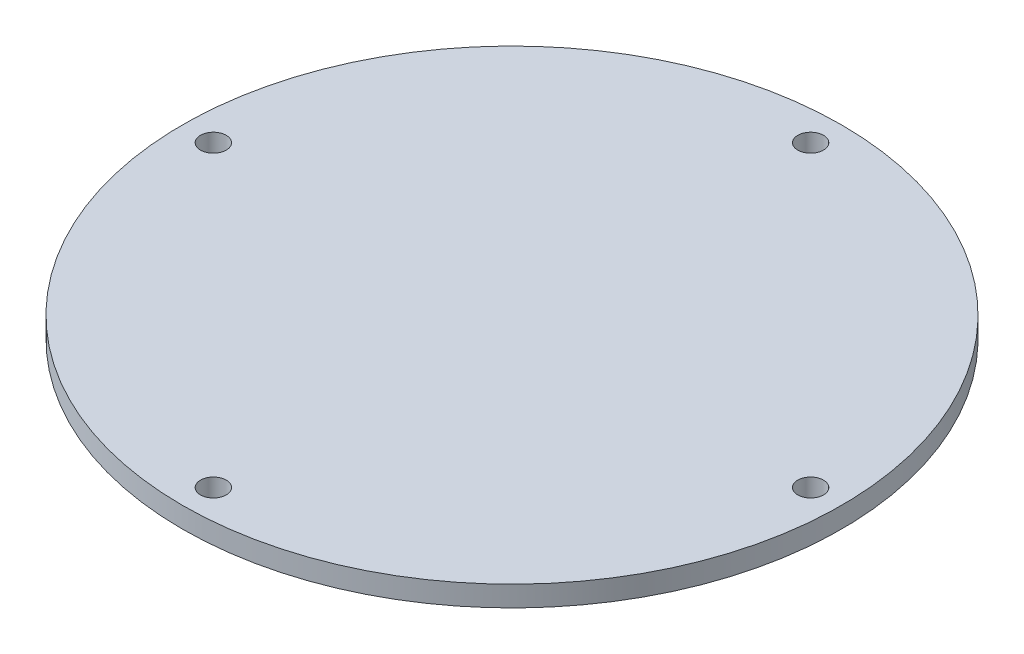
ISO-10303-21;
HEADER;
FILE_DESCRIPTION(('STEP AP214'),'2;1');
FILE_NAME('part.step','',(''),(''),'','','');
FILE_SCHEMA(('AUTOMOTIVE_DESIGN { 1 0 10303 214 1 1 1 1 }'));
ENDSEC;
DATA;
#1=APPLICATION_CONTEXT('core data for automotive mechanical design processes');
#2=APPLICATION_PROTOCOL_DEFINITION('international standard','automotive_design',2000,#1);
#3=PRODUCT_CONTEXT('',#1,'mechanical');
#4=PRODUCT('Part','Part','',(#3));
#5=PRODUCT_RELATED_PRODUCT_CATEGORY('part','',(#4));
#6=PRODUCT_DEFINITION_FORMATION('','',#4);
#7=PRODUCT_DEFINITION_CONTEXT('part definition',#1,'design');
#8=PRODUCT_DEFINITION('design','',#6,#7);
#9=PRODUCT_DEFINITION_SHAPE('','',#8);
#10=(LENGTH_UNIT() NAMED_UNIT(*) SI_UNIT(.MILLI.,.METRE.));
#11=(NAMED_UNIT(*) PLANE_ANGLE_UNIT() SI_UNIT($,.RADIAN.));
#12=(NAMED_UNIT(*) SI_UNIT($,.STERADIAN.) SOLID_ANGLE_UNIT());
#13=UNCERTAINTY_MEASURE_WITH_UNIT(LENGTH_MEASURE(1.E-05),#10,'distance_accuracy_value','');
#14=(GEOMETRIC_REPRESENTATION_CONTEXT(3) GLOBAL_UNCERTAINTY_ASSIGNED_CONTEXT((#13)) GLOBAL_UNIT_ASSIGNED_CONTEXT((#10,
#11,#12)) REPRESENTATION_CONTEXT('',''));
#15=CARTESIAN_POINT('',(0.,0.,0.));
#16=DIRECTION('',(0.,0.,1.));
#17=DIRECTION('',(1.,0.,0.));
#18=AXIS2_PLACEMENT_3D('',#15,#16,#17);
#19=CARTESIAN_POINT('',(0.,3.175,0.));
#20=DIRECTION('',(0.,1.,0.));
#21=DIRECTION('',(0.,0.,1.));
#22=AXIS2_PLACEMENT_3D('',#19,#20,#21);
#23=PLANE('',#22);
#24=CARTESIAN_POINT('',(0.,3.175,46.0327928766005));
#25=DIRECTION('',(0.,1.,0.));
#26=DIRECTION('',(0.,0.,1.));
#27=AXIS2_PLACEMENT_3D('',#24,#25,#26);
#28=CIRCLE('',#27,1.98437499999999);
#29=CARTESIAN_POINT('',(0.,3.175,48.0171678766005));
#30=VERTEX_POINT('',#29);
#31=EDGE_CURVE('E53',#30,#30,#28,.T.);
#32=ORIENTED_EDGE('',*,*,#31,.F.);
#33=EDGE_LOOP('',(#32));
#34=FACE_BOUND('',#33,.T.);
#35=CARTESIAN_POINT('',(0.,3.175,-46.0327928766005));
#36=DIRECTION('',(0.,1.,0.));
#37=DIRECTION('',(0.,0.,1.));
#38=AXIS2_PLACEMENT_3D('',#35,#36,#37);
#39=CIRCLE('',#38,1.984375);
#40=CARTESIAN_POINT('',(0.,3.175,-44.0484178766005));
#41=VERTEX_POINT('',#40);
#42=EDGE_CURVE('E42',#41,#41,#39,.T.);
#43=ORIENTED_EDGE('',*,*,#42,.F.);
#44=EDGE_LOOP('',(#43));
#45=FACE_BOUND('',#44,.T.);
#46=CARTESIAN_POINT('',(0.,3.175,0.));
#47=DIRECTION('',(0.,1.,0.));
#48=DIRECTION('',(0.,0.,1.));
#49=AXIS2_PLACEMENT_3D('',#46,#47,#48);
#50=CIRCLE('',#49,50.8);
#51=CARTESIAN_POINT('',(0.,3.175,50.8));
#52=VERTEX_POINT('',#51);
#53=EDGE_CURVE('E10',#52,#52,#50,.T.);
#54=ORIENTED_EDGE('',*,*,#53,.T.);
#55=EDGE_LOOP('',(#54));
#56=FACE_BOUND('',#55,.T.);
#57=CARTESIAN_POINT('',(46.0327928766005,3.175,0.));
#58=DIRECTION('',(0.,1.,0.));
#59=DIRECTION('',(0.,0.,1.));
#60=AXIS2_PLACEMENT_3D('',#57,#58,#59);
#61=CIRCLE('',#60,1.984375);
#62=CARTESIAN_POINT('',(46.0327928766005,3.175,1.984375));
#63=VERTEX_POINT('',#62);
#64=EDGE_CURVE('E47',#63,#63,#61,.T.);
#65=ORIENTED_EDGE('',*,*,#64,.F.);
#66=EDGE_LOOP('',(#65));
#67=FACE_BOUND('',#66,.T.);
#68=CARTESIAN_POINT('',(-46.0327928766005,3.175,0.));
#69=DIRECTION('',(0.,1.,0.));
#70=DIRECTION('',(0.,0.,1.));
#71=AXIS2_PLACEMENT_3D('',#68,#69,#70);
#72=CIRCLE('',#71,1.984375);
#73=CARTESIAN_POINT('',(-46.0327928766005,3.175,1.984375));
#74=VERTEX_POINT('',#73);
#75=EDGE_CURVE('E59',#74,#74,#72,.T.);
#76=ORIENTED_EDGE('',*,*,#75,.F.);
#77=EDGE_LOOP('',(#76));
#78=FACE_BOUND('',#77,.T.);
#79=ADVANCED_FACE('F31',(#34,#45,#56,#67,#78),#23,.T.);
#80=CARTESIAN_POINT('',(0.,0.,0.));
#81=DIRECTION('',(0.,1.,0.));
#82=DIRECTION('',(0.,0.,1.));
#83=AXIS2_PLACEMENT_3D('',#80,#81,#82);
#84=PLANE('',#83);
#85=CARTESIAN_POINT('',(0.,0.,0.));
#86=DIRECTION('',(0.,1.,0.));
#87=DIRECTION('',(0.,0.,1.));
#88=AXIS2_PLACEMENT_3D('',#85,#86,#87);
#89=CIRCLE('',#88,50.8);
#90=CARTESIAN_POINT('',(0.,0.,50.8));
#91=VERTEX_POINT('',#90);
#92=EDGE_CURVE('E35',#91,#91,#89,.T.);
#93=ORIENTED_EDGE('',*,*,#92,.F.);
#94=EDGE_LOOP('',(#93));
#95=FACE_BOUND('',#94,.T.);
#96=CARTESIAN_POINT('',(0.,0.,-46.0327928766005));
#97=DIRECTION('',(0.,1.,0.));
#98=DIRECTION('',(0.,0.,1.));
#99=AXIS2_PLACEMENT_3D('',#96,#97,#98);
#100=CIRCLE('',#99,1.984375);
#101=CARTESIAN_POINT('',(0.,0.,-44.0484178766005));
#102=VERTEX_POINT('',#101);
#103=EDGE_CURVE('E44',#102,#102,#100,.T.);
#104=ORIENTED_EDGE('',*,*,#103,.T.);
#105=EDGE_LOOP('',(#104));
#106=FACE_BOUND('',#105,.T.);
#107=CARTESIAN_POINT('',(46.0327928766005,0.,0.));
#108=DIRECTION('',(0.,1.,0.));
#109=DIRECTION('',(0.,0.,1.));
#110=AXIS2_PLACEMENT_3D('',#107,#108,#109);
#111=CIRCLE('',#110,1.984375);
#112=CARTESIAN_POINT('',(46.0327928766005,0.,1.984375));
#113=VERTEX_POINT('',#112);
#114=EDGE_CURVE('E50',#113,#113,#111,.T.);
#115=ORIENTED_EDGE('',*,*,#114,.T.);
#116=EDGE_LOOP('',(#115));
#117=FACE_BOUND('',#116,.T.);
#118=CARTESIAN_POINT('',(0.,0.,46.0327928766005));
#119=DIRECTION('',(0.,1.,0.));
#120=DIRECTION('',(0.,0.,1.));
#121=AXIS2_PLACEMENT_3D('',#118,#119,#120);
#122=CIRCLE('',#121,1.98437499999999);
#123=CARTESIAN_POINT('',(0.,0.,48.0171678766005));
#124=VERTEX_POINT('',#123);
#125=EDGE_CURVE('E56',#124,#124,#122,.T.);
#126=ORIENTED_EDGE('',*,*,#125,.T.);
#127=EDGE_LOOP('',(#126));
#128=FACE_BOUND('',#127,.T.);
#129=CARTESIAN_POINT('',(-46.0327928766005,0.,0.));
#130=DIRECTION('',(0.,1.,0.));
#131=DIRECTION('',(0.,0.,1.));
#132=AXIS2_PLACEMENT_3D('',#129,#130,#131);
#133=CIRCLE('',#132,1.984375);
#134=CARTESIAN_POINT('',(-46.0327928766005,0.,1.984375));
#135=VERTEX_POINT('',#134);
#136=EDGE_CURVE('E62',#135,#135,#133,.T.);
#137=ORIENTED_EDGE('',*,*,#136,.T.);
#138=EDGE_LOOP('',(#137));
#139=FACE_BOUND('',#138,.T.);
#140=ADVANCED_FACE('F72',(#95,#106,#117,#128,#139),#84,.F.);
#141=CARTESIAN_POINT('',(0.,3.175,0.));
#142=DIRECTION('',(0.,-1.,0.));
#143=DIRECTION('',(0.,0.,-1.));
#144=AXIS2_PLACEMENT_3D('',#141,#142,#143);
#145=CYLINDRICAL_SURFACE('',#144,50.8);
#146=ORIENTED_EDGE('',*,*,#53,.F.);
#147=EDGE_LOOP('',(#146));
#148=FACE_BOUND('',#147,.T.);
#149=ORIENTED_EDGE('',*,*,#92,.T.);
#150=EDGE_LOOP('',(#149));
#151=FACE_BOUND('',#150,.T.);
#152=ADVANCED_FACE('F33',(#148,#151),#145,.T.);
#153=CARTESIAN_POINT('',(0.,3.175,-46.0327928766005));
#154=DIRECTION('',(0.,-1.,0.));
#155=DIRECTION('',(0.,0.,-1.));
#156=AXIS2_PLACEMENT_3D('',#153,#154,#155);
#157=CYLINDRICAL_SURFACE('',#156,1.984375);
#158=ORIENTED_EDGE('',*,*,#42,.T.);
#159=EDGE_LOOP('',(#158));
#160=FACE_BOUND('',#159,.T.);
#161=ORIENTED_EDGE('',*,*,#103,.F.);
#162=EDGE_LOOP('',(#161));
#163=FACE_BOUND('',#162,.T.);
#164=ADVANCED_FACE('F82',(#160,#163),#157,.F.);
#165=CARTESIAN_POINT('',(46.0327928766005,3.175,0.));
#166=DIRECTION('',(0.,-1.,0.));
#167=DIRECTION('',(0.,0.,-1.));
#168=AXIS2_PLACEMENT_3D('',#165,#166,#167);
#169=CYLINDRICAL_SURFACE('',#168,1.984375);
#170=ORIENTED_EDGE('',*,*,#64,.T.);
#171=EDGE_LOOP('',(#170));
#172=FACE_BOUND('',#171,.T.);
#173=ORIENTED_EDGE('',*,*,#114,.F.);
#174=EDGE_LOOP('',(#173));
#175=FACE_BOUND('',#174,.T.);
#176=ADVANCED_FACE('F85',(#172,#175),#169,.F.);
#177=CARTESIAN_POINT('',(0.,3.175,46.0327928766005));
#178=DIRECTION('',(0.,-1.,0.));
#179=DIRECTION('',(0.,0.,-1.));
#180=AXIS2_PLACEMENT_3D('',#177,#178,#179);
#181=CYLINDRICAL_SURFACE('',#180,1.98437499999999);
#182=ORIENTED_EDGE('',*,*,#31,.T.);
#183=EDGE_LOOP('',(#182));
#184=FACE_BOUND('',#183,.T.);
#185=ORIENTED_EDGE('',*,*,#125,.F.);
#186=EDGE_LOOP('',(#185));
#187=FACE_BOUND('',#186,.T.);
#188=ADVANCED_FACE('F89',(#184,#187),#181,.F.);
#189=CARTESIAN_POINT('',(-46.0327928766005,3.175,0.));
#190=DIRECTION('',(0.,-1.,0.));
#191=DIRECTION('',(0.,0.,-1.));
#192=AXIS2_PLACEMENT_3D('',#189,#190,#191);
#193=CYLINDRICAL_SURFACE('',#192,1.984375);
#194=ORIENTED_EDGE('',*,*,#75,.T.);
#195=EDGE_LOOP('',(#194));
#196=FACE_BOUND('',#195,.T.);
#197=ORIENTED_EDGE('',*,*,#136,.F.);
#198=EDGE_LOOP('',(#197));
#199=FACE_BOUND('',#198,.T.);
#200=ADVANCED_FACE('F68',(#196,#199),#193,.F.);
#201=CLOSED_SHELL('',(#79,#140,#152,#164,#176,#188,#200));
#202=MANIFOLD_SOLID_BREP('B2',#201);
#203=ADVANCED_BREP_SHAPE_REPRESENTATION('',(#18,#202),#14);
#204=SHAPE_DEFINITION_REPRESENTATION(#9,#203);
ENDSEC;
END-ISO-10303-21;
